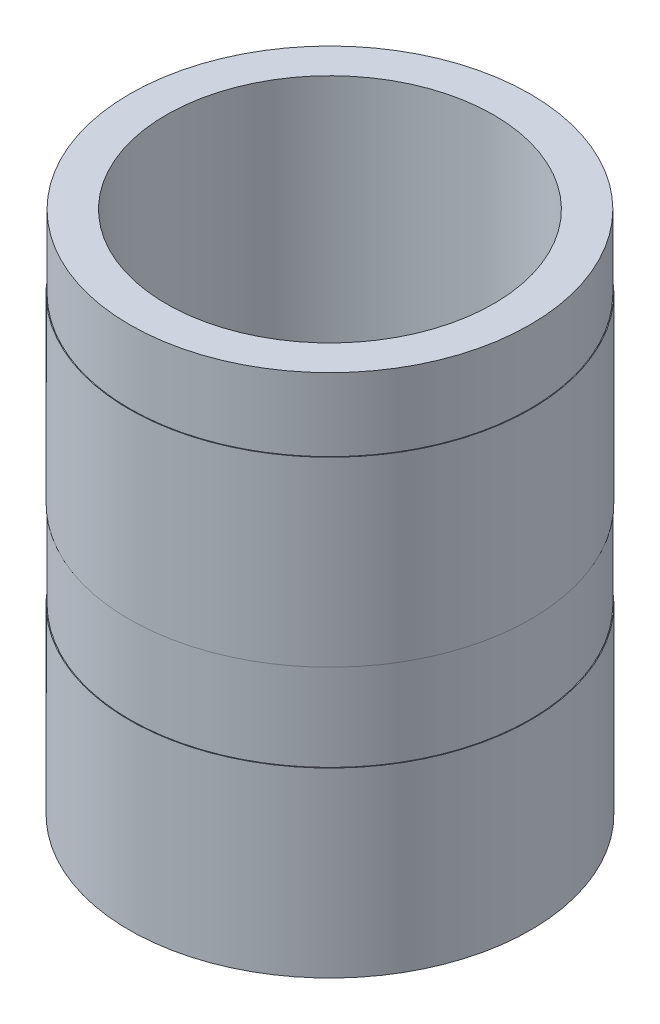
ISO-10303-21;
HEADER;
FILE_DESCRIPTION(('STEP AP214'),'2;1');
FILE_NAME('part.step','',(''),(''),'','','');
FILE_SCHEMA(('AUTOMOTIVE_DESIGN { 1 0 10303 214 1 1 1 1 }'));
ENDSEC;
DATA;
#1=APPLICATION_CONTEXT('core data for automotive mechanical design processes');
#2=APPLICATION_PROTOCOL_DEFINITION('international standard','automotive_design',2000,#1);
#3=PRODUCT_CONTEXT('',#1,'mechanical');
#4=PRODUCT('Part','Part','',(#3));
#5=PRODUCT_RELATED_PRODUCT_CATEGORY('part','',(#4));
#6=PRODUCT_DEFINITION_FORMATION('','',#4);
#7=PRODUCT_DEFINITION_CONTEXT('part definition',#1,'design');
#8=PRODUCT_DEFINITION('design','',#6,#7);
#9=PRODUCT_DEFINITION_SHAPE('','',#8);
#10=(LENGTH_UNIT() NAMED_UNIT(*) SI_UNIT(.MILLI.,.METRE.));
#11=(NAMED_UNIT(*) PLANE_ANGLE_UNIT() SI_UNIT($,.RADIAN.));
#12=(NAMED_UNIT(*) SI_UNIT($,.STERADIAN.) SOLID_ANGLE_UNIT());
#13=UNCERTAINTY_MEASURE_WITH_UNIT(LENGTH_MEASURE(1.E-05),#10,'distance_accuracy_value','');
#14=(GEOMETRIC_REPRESENTATION_CONTEXT(3) GLOBAL_UNCERTAINTY_ASSIGNED_CONTEXT((#13)) GLOBAL_UNIT_ASSIGNED_CONTEXT((#10,
#11,#12)) REPRESENTATION_CONTEXT('',''));
#15=CARTESIAN_POINT('',(0.,0.,0.));
#16=DIRECTION('',(0.,0.,1.));
#17=DIRECTION('',(1.,0.,0.));
#18=AXIS2_PLACEMENT_3D('',#15,#16,#17);
#19=CARTESIAN_POINT('',(0.,0.,0.));
#20=DIRECTION('',(0.,-1.,0.));
#21=DIRECTION('',(0.,0.,-1.));
#22=AXIS2_PLACEMENT_3D('',#19,#20,#21);
#23=PLANE('',#22);
#24=CARTESIAN_POINT('',(0.,0.,0.));
#25=DIRECTION('',(0.,-1.,0.));
#26=DIRECTION('',(0.,0.,-1.));
#27=AXIS2_PLACEMENT_3D('',#24,#25,#26);
#28=CIRCLE('',#27,27.6);
#29=CARTESIAN_POINT('',(0.,0.,-27.6));
#30=VERTEX_POINT('',#29);
#31=EDGE_CURVE('E10',#30,#30,#28,.T.);
#32=ORIENTED_EDGE('',*,*,#31,.T.);
#33=EDGE_LOOP('',(#32));
#34=FACE_BOUND('',#33,.T.);
#35=CARTESIAN_POINT('',(0.,0.,0.));
#36=DIRECTION('',(0.,-1.,0.));
#37=DIRECTION('',(0.,0.,-1.));
#38=AXIS2_PLACEMENT_3D('',#35,#36,#37);
#39=CIRCLE('',#38,22.5);
#40=CARTESIAN_POINT('',(0.,0.,-22.5));
#41=VERTEX_POINT('',#40);
#42=EDGE_CURVE('E84',#41,#41,#39,.T.);
#43=ORIENTED_EDGE('',*,*,#42,.F.);
#44=EDGE_LOOP('',(#43));
#45=FACE_BOUND('',#44,.T.);
#46=ADVANCED_FACE('F41',(#34,#45),#23,.T.);
#47=CARTESIAN_POINT('',(0.,0.,0.));
#48=DIRECTION('',(0.,-1.,0.));
#49=DIRECTION('',(0.,0.,-1.));
#50=AXIS2_PLACEMENT_3D('',#47,#48,#49);
#51=CYLINDRICAL_SURFACE('',#50,27.6);
#52=ORIENTED_EDGE('',*,*,#31,.F.);
#53=EDGE_LOOP('',(#52));
#54=FACE_BOUND('',#53,.T.);
#55=CARTESIAN_POINT('',(0.,25.,0.));
#56=DIRECTION('',(0.,-1.,0.));
#57=DIRECTION('',(0.,0.,-1.));
#58=AXIS2_PLACEMENT_3D('',#55,#56,#57);
#59=CIRCLE('',#58,27.6);
#60=CARTESIAN_POINT('',(0.,25.,-27.6));
#61=VERTEX_POINT('',#60);
#62=EDGE_CURVE('E48',#61,#61,#59,.T.);
#63=ORIENTED_EDGE('',*,*,#62,.T.);
#64=EDGE_LOOP('',(#63));
#65=FACE_BOUND('',#64,.T.);
#66=ADVANCED_FACE('F92',(#54,#65),#51,.T.);
#67=CARTESIAN_POINT('',(0.,25.,0.));
#68=DIRECTION('',(0.,-1.,0.));
#69=DIRECTION('',(0.,0.,-1.));
#70=AXIS2_PLACEMENT_3D('',#67,#68,#69);
#71=PLANE('',#70);
#72=ORIENTED_EDGE('',*,*,#62,.F.);
#73=EDGE_LOOP('',(#72));
#74=FACE_BOUND('',#73,.T.);
#75=CARTESIAN_POINT('',(0.,25.,0.));
#76=DIRECTION('',(0.,-1.,0.));
#77=DIRECTION('',(0.,0.,-1.));
#78=AXIS2_PLACEMENT_3D('',#75,#76,#77);
#79=CIRCLE('',#78,27.5);
#80=CARTESIAN_POINT('',(0.,25.,-27.5));
#81=VERTEX_POINT('',#80);
#82=EDGE_CURVE('E53',#81,#81,#79,.T.);
#83=ORIENTED_EDGE('',*,*,#82,.T.);
#84=EDGE_LOOP('',(#83));
#85=FACE_BOUND('',#84,.T.);
#86=ADVANCED_FACE('F96',(#74,#85),#71,.F.);
#87=CARTESIAN_POINT('',(0.,0.,0.));
#88=DIRECTION('',(0.,-1.,0.));
#89=DIRECTION('',(0.,0.,-1.));
#90=AXIS2_PLACEMENT_3D('',#87,#88,#89);
#91=CYLINDRICAL_SURFACE('',#90,27.5);
#92=CARTESIAN_POINT('',(0.,37.,0.));
#93=DIRECTION('',(0.,-1.,0.));
#94=DIRECTION('',(0.,0.,-1.));
#95=AXIS2_PLACEMENT_3D('',#92,#93,#94);
#96=CIRCLE('',#95,27.5);
#97=CARTESIAN_POINT('',(0.,37.,-27.5));
#98=VERTEX_POINT('',#97);
#99=EDGE_CURVE('E58',#98,#98,#96,.T.);
#100=ORIENTED_EDGE('',*,*,#99,.T.);
#101=EDGE_LOOP('',(#100));
#102=FACE_BOUND('',#101,.T.);
#103=ORIENTED_EDGE('',*,*,#82,.F.);
#104=EDGE_LOOP('',(#103));
#105=FACE_BOUND('',#104,.T.);
#106=ADVANCED_FACE('F101',(#102,#105),#91,.T.);
#107=CARTESIAN_POINT('',(0.,37.,0.));
#108=DIRECTION('',(0.,1.,0.));
#109=DIRECTION('',(0.,0.,1.));
#110=AXIS2_PLACEMENT_3D('',#107,#108,#109);
#111=PLANE('',#110);
#112=ORIENTED_EDGE('',*,*,#99,.F.);
#113=EDGE_LOOP('',(#112));
#114=FACE_BOUND('',#113,.T.);
#115=CARTESIAN_POINT('',(0.,37.,0.));
#116=DIRECTION('',(0.,-1.,0.));
#117=DIRECTION('',(0.,0.,-1.));
#118=AXIS2_PLACEMENT_3D('',#115,#116,#117);
#119=CIRCLE('',#118,27.6);
#120=CARTESIAN_POINT('',(0.,37.,-27.6));
#121=VERTEX_POINT('',#120);
#122=EDGE_CURVE('E64',#121,#121,#119,.T.);
#123=ORIENTED_EDGE('',*,*,#122,.T.);
#124=EDGE_LOOP('',(#123));
#125=FACE_BOUND('',#124,.T.);
#126=ADVANCED_FACE('F105',(#114,#125),#111,.F.);
#127=CARTESIAN_POINT('',(0.,0.,0.));
#128=DIRECTION('',(0.,-1.,0.));
#129=DIRECTION('',(0.,0.,-1.));
#130=AXIS2_PLACEMENT_3D('',#127,#128,#129);
#131=CYLINDRICAL_SURFACE('',#130,27.6);
#132=ORIENTED_EDGE('',*,*,#122,.F.);
#133=EDGE_LOOP('',(#132));
#134=FACE_BOUND('',#133,.T.);
#135=CARTESIAN_POINT('',(0.,62.,0.));
#136=DIRECTION('',(0.,-1.,0.));
#137=DIRECTION('',(0.,0.,-1.));
#138=AXIS2_PLACEMENT_3D('',#135,#136,#137);
#139=CIRCLE('',#138,27.6);
#140=CARTESIAN_POINT('',(0.,62.,-27.6));
#141=VERTEX_POINT('',#140);
#142=EDGE_CURVE('E68',#141,#141,#139,.T.);
#143=ORIENTED_EDGE('',*,*,#142,.T.);
#144=EDGE_LOOP('',(#143));
#145=FACE_BOUND('',#144,.T.);
#146=ADVANCED_FACE('F108',(#134,#145),#131,.T.);
#147=CARTESIAN_POINT('',(-4.30211422042237E-12,62.,0.));
#148=DIRECTION('',(0.,1.,0.));
#149=DIRECTION('',(0.,0.,1.));
#150=AXIS2_PLACEMENT_3D('',#147,#148,#149);
#151=PLANE('',#150);
#152=CARTESIAN_POINT('',(0.,62.,0.));
#153=DIRECTION('',(0.,-1.,0.));
#154=DIRECTION('',(0.,0.,-1.));
#155=AXIS2_PLACEMENT_3D('',#152,#153,#154);
#156=CIRCLE('',#155,27.5);
#157=CARTESIAN_POINT('',(0.,62.,-27.5));
#158=VERTEX_POINT('',#157);
#159=EDGE_CURVE('E72',#158,#158,#156,.T.);
#160=ORIENTED_EDGE('',*,*,#159,.T.);
#161=EDGE_LOOP('',(#160));
#162=FACE_BOUND('',#161,.T.);
#163=ORIENTED_EDGE('',*,*,#142,.F.);
#164=EDGE_LOOP('',(#163));
#165=FACE_BOUND('',#164,.T.);
#166=ADVANCED_FACE('F112',(#162,#165),#151,.T.);
#167=CARTESIAN_POINT('',(0.,72.,0.));
#168=DIRECTION('',(0.,-1.,0.));
#169=DIRECTION('',(0.,0.,-1.));
#170=AXIS2_PLACEMENT_3D('',#167,#168,#169);
#171=CIRCLE('',#170,27.5);
#172=CARTESIAN_POINT('',(0.,72.,-27.5));
#173=VERTEX_POINT('',#172);
#174=EDGE_CURVE('E76',#173,#173,#171,.T.);
#175=ORIENTED_EDGE('',*,*,#174,.T.);
#176=EDGE_LOOP('',(#175));
#177=FACE_BOUND('',#176,.T.);
#178=ORIENTED_EDGE('',*,*,#159,.F.);
#179=EDGE_LOOP('',(#178));
#180=FACE_BOUND('',#179,.T.);
#181=ADVANCED_FACE('F116',(#177,#180),#91,.T.);
#182=CARTESIAN_POINT('',(0.,72.,0.));
#183=DIRECTION('',(0.,-1.,0.));
#184=DIRECTION('',(0.,0.,-1.));
#185=AXIS2_PLACEMENT_3D('',#182,#183,#184);
#186=PLANE('',#185);
#187=ORIENTED_EDGE('',*,*,#174,.F.);
#188=EDGE_LOOP('',(#187));
#189=FACE_BOUND('',#188,.T.);
#190=CARTESIAN_POINT('',(0.,72.,0.));
#191=DIRECTION('',(0.,-1.,0.));
#192=DIRECTION('',(0.,0.,-1.));
#193=AXIS2_PLACEMENT_3D('',#190,#191,#192);
#194=CIRCLE('',#193,22.5);
#195=CARTESIAN_POINT('',(0.,72.,-22.5));
#196=VERTEX_POINT('',#195);
#197=EDGE_CURVE('E80',#196,#196,#194,.T.);
#198=ORIENTED_EDGE('',*,*,#197,.T.);
#199=EDGE_LOOP('',(#198));
#200=FACE_BOUND('',#199,.T.);
#201=ADVANCED_FACE('F120',(#189,#200),#186,.F.);
#202=CARTESIAN_POINT('',(0.,0.,0.));
#203=DIRECTION('',(0.,-1.,0.));
#204=DIRECTION('',(0.,0.,-1.));
#205=AXIS2_PLACEMENT_3D('',#202,#203,#204);
#206=CYLINDRICAL_SURFACE('',#205,22.5);
#207=ORIENTED_EDGE('',*,*,#197,.F.);
#208=EDGE_LOOP('',(#207));
#209=FACE_BOUND('',#208,.T.);
#210=ORIENTED_EDGE('',*,*,#42,.T.);
#211=EDGE_LOOP('',(#210));
#212=FACE_BOUND('',#211,.T.);
#213=ADVANCED_FACE('F89',(#209,#212),#206,.F.);
#214=CLOSED_SHELL('',(#46,#66,#86,#106,#126,#146,#166,#181,#201,#213));
#215=MANIFOLD_SOLID_BREP('B2',#214);
#216=ADVANCED_BREP_SHAPE_REPRESENTATION('',(#18,#215),#14);
#217=SHAPE_DEFINITION_REPRESENTATION(#9,#216);
ENDSEC;
END-ISO-10303-21;
